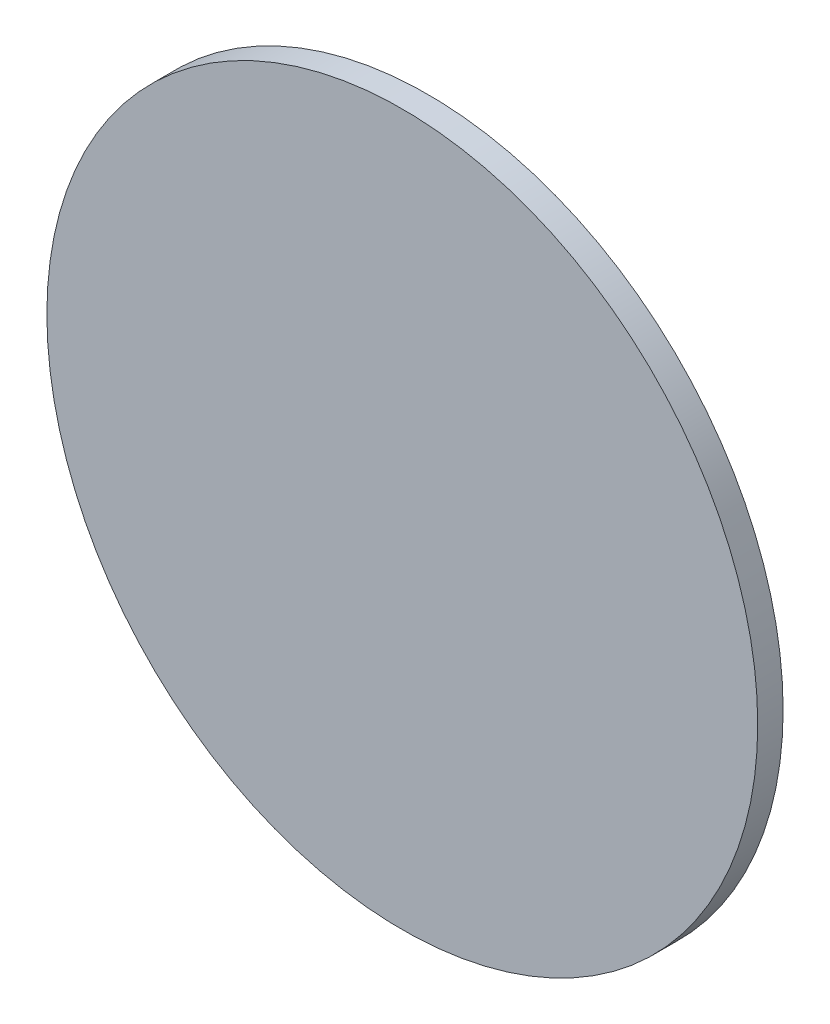
ISO-10303-21;
HEADER;
FILE_DESCRIPTION(('STEP AP214'),'2;1');
FILE_NAME('part.step','',(''),(''),'','','');
FILE_SCHEMA(('AUTOMOTIVE_DESIGN { 1 0 10303 214 1 1 1 1 }'));
ENDSEC;
DATA;
#1=APPLICATION_CONTEXT('core data for automotive mechanical design processes');
#2=APPLICATION_PROTOCOL_DEFINITION('international standard','automotive_design',2000,#1);
#3=PRODUCT_CONTEXT('',#1,'mechanical');
#4=PRODUCT('Part','Part','',(#3));
#5=PRODUCT_RELATED_PRODUCT_CATEGORY('part','',(#4));
#6=PRODUCT_DEFINITION_FORMATION('','',#4);
#7=PRODUCT_DEFINITION_CONTEXT('part definition',#1,'design');
#8=PRODUCT_DEFINITION('design','',#6,#7);
#9=PRODUCT_DEFINITION_SHAPE('','',#8);
#10=(LENGTH_UNIT() NAMED_UNIT(*) SI_UNIT(.MILLI.,.METRE.));
#11=(NAMED_UNIT(*) PLANE_ANGLE_UNIT() SI_UNIT($,.RADIAN.));
#12=(NAMED_UNIT(*) SI_UNIT($,.STERADIAN.) SOLID_ANGLE_UNIT());
#13=UNCERTAINTY_MEASURE_WITH_UNIT(LENGTH_MEASURE(1.E-05),#10,'distance_accuracy_value','');
#14=(GEOMETRIC_REPRESENTATION_CONTEXT(3) GLOBAL_UNCERTAINTY_ASSIGNED_CONTEXT((#13)) GLOBAL_UNIT_ASSIGNED_CONTEXT((#10,
#11,#12)) REPRESENTATION_CONTEXT('',''));
#15=CARTESIAN_POINT('',(0.,0.,0.));
#16=DIRECTION('',(0.,0.,1.));
#17=DIRECTION('',(1.,0.,0.));
#18=AXIS2_PLACEMENT_3D('',#15,#16,#17);
#19=CARTESIAN_POINT('',(0.,0.,10.));
#20=DIRECTION('',(0.,0.,-1.));
#21=DIRECTION('',(-1.,0.,0.));
#22=AXIS2_PLACEMENT_3D('',#19,#20,#21);
#23=CYLINDRICAL_SURFACE('',#22,140.);
#24=CARTESIAN_POINT('',(0.,0.,10.));
#25=DIRECTION('',(0.,0.,1.));
#26=DIRECTION('',(1.,0.,0.));
#27=AXIS2_PLACEMENT_3D('',#24,#25,#26);
#28=CIRCLE('',#27,140.);
#29=CARTESIAN_POINT('',(140.,0.,10.));
#30=VERTEX_POINT('',#29);
#31=EDGE_CURVE('E10',#30,#30,#28,.T.);
#32=ORIENTED_EDGE('',*,*,#31,.F.);
#33=EDGE_LOOP('',(#32));
#34=FACE_BOUND('',#33,.T.);
#35=CARTESIAN_POINT('',(0.,0.,0.));
#36=DIRECTION('',(0.,0.,1.));
#37=DIRECTION('',(1.,0.,0.));
#38=AXIS2_PLACEMENT_3D('',#35,#36,#37);
#39=CIRCLE('',#38,140.);
#40=CARTESIAN_POINT('',(140.,0.,0.));
#41=VERTEX_POINT('',#40);
#42=EDGE_CURVE('E33',#41,#41,#39,.T.);
#43=ORIENTED_EDGE('',*,*,#42,.T.);
#44=EDGE_LOOP('',(#43));
#45=FACE_BOUND('',#44,.T.);
#46=ADVANCED_FACE('F30',(#34,#45),#23,.T.);
#47=CARTESIAN_POINT('',(0.,0.,10.));
#48=DIRECTION('',(0.,0.,1.));
#49=DIRECTION('',(1.,0.,0.));
#50=AXIS2_PLACEMENT_3D('',#47,#48,#49);
#51=PLANE('',#50);
#52=ORIENTED_EDGE('',*,*,#31,.T.);
#53=EDGE_LOOP('',(#52));
#54=FACE_BOUND('',#53,.T.);
#55=ADVANCED_FACE('F45',(#54),#51,.T.);
#56=CARTESIAN_POINT('',(0.,0.,0.));
#57=DIRECTION('',(0.,0.,1.));
#58=DIRECTION('',(1.,0.,0.));
#59=AXIS2_PLACEMENT_3D('',#56,#57,#58);
#60=PLANE('',#59);
#61=ORIENTED_EDGE('',*,*,#42,.F.);
#62=EDGE_LOOP('',(#61));
#63=FACE_BOUND('',#62,.T.);
#64=ADVANCED_FACE('F43',(#63),#60,.F.);
#65=CLOSED_SHELL('',(#46,#55,#64));
#66=MANIFOLD_SOLID_BREP('B2',#65);
#67=ADVANCED_BREP_SHAPE_REPRESENTATION('',(#18,#66),#14);
#68=SHAPE_DEFINITION_REPRESENTATION(#9,#67);
ENDSEC;
END-ISO-10303-21;
